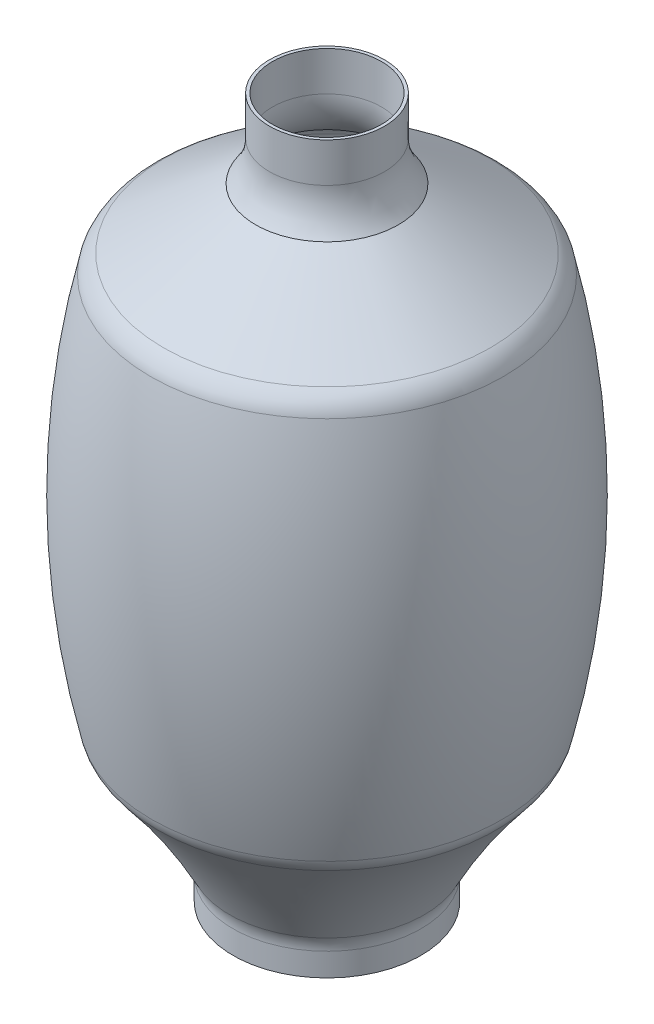
ISO-10303-21;
HEADER;
FILE_DESCRIPTION(('STEP AP214'),'2;1');
FILE_NAME('part.step','',(''),(''),'','','');
FILE_SCHEMA(('AUTOMOTIVE_DESIGN { 1 0 10303 214 1 1 1 1 }'));
ENDSEC;
DATA;
#1=APPLICATION_CONTEXT('core data for automotive mechanical design processes');
#2=APPLICATION_PROTOCOL_DEFINITION('international standard','automotive_design',2000,#1);
#3=PRODUCT_CONTEXT('',#1,'mechanical');
#4=PRODUCT('Part','Part','',(#3));
#5=PRODUCT_RELATED_PRODUCT_CATEGORY('part','',(#4));
#6=PRODUCT_DEFINITION_FORMATION('','',#4);
#7=PRODUCT_DEFINITION_CONTEXT('part definition',#1,'design');
#8=PRODUCT_DEFINITION('design','',#6,#7);
#9=PRODUCT_DEFINITION_SHAPE('','',#8);
#10=(LENGTH_UNIT() NAMED_UNIT(*) SI_UNIT(.MILLI.,.METRE.));
#11=(NAMED_UNIT(*) PLANE_ANGLE_UNIT() SI_UNIT($,.RADIAN.));
#12=(NAMED_UNIT(*) SI_UNIT($,.STERADIAN.) SOLID_ANGLE_UNIT());
#13=UNCERTAINTY_MEASURE_WITH_UNIT(LENGTH_MEASURE(1.E-05),#10,'distance_accuracy_value','');
#14=(GEOMETRIC_REPRESENTATION_CONTEXT(3) GLOBAL_UNCERTAINTY_ASSIGNED_CONTEXT((#13)) GLOBAL_UNIT_ASSIGNED_CONTEXT((#10,
#11,#12)) REPRESENTATION_CONTEXT('',''));
#15=CARTESIAN_POINT('',(0.,0.,0.));
#16=DIRECTION('',(0.,0.,1.));
#17=DIRECTION('',(1.,0.,0.));
#18=AXIS2_PLACEMENT_3D('',#15,#16,#17);
#19=CARTESIAN_POINT('',(57.3,-126.737836382813,0.));
#20=DIRECTION('',(0.,-1.,0.));
#21=DIRECTION('',(0.,0.,-1.));
#22=AXIS2_PLACEMENT_3D('',#19,#20,#21);
#23=TOROIDAL_SURFACE('',#22,206.488914650666,195.754467192042);
#24=CARTESIAN_POINT('',(57.3,-37.8267914431677,0.));
#25=DIRECTION('',(0.,-1.,0.));
#26=DIRECTION('',(0.,0.,-1.));
#27=AXIS2_PLACEMENT_3D('',#24,#25,#26);
#28=CIRCLE('',#27,32.0909860122193);
#29=CARTESIAN_POINT('',(57.3,-37.8267914431677,-32.0909860122193));
#30=VERTEX_POINT('',#29);
#31=EDGE_CURVE('E51',#30,#30,#28,.F.);
#32=ORIENTED_EDGE('',*,*,#31,.T.);
#33=EDGE_LOOP('',(#32));
#34=FACE_BOUND('',#33,.T.);
#35=CARTESIAN_POINT('',(57.3,-1.74966390814843,0.));
#36=DIRECTION('',(0.,-1.,0.));
#37=DIRECTION('',(0.,0.,-1.));
#38=AXIS2_PLACEMENT_3D('',#35,#36,#37);
#39=CIRCLE('',#38,55.8311296972031);
#40=CARTESIAN_POINT('',(57.3,-1.74966390814843,-55.8311296972031));
#41=VERTEX_POINT('',#40);
#42=EDGE_CURVE('E55',#41,#41,#39,.T.);
#43=ORIENTED_EDGE('',*,*,#42,.T.);
#44=EDGE_LOOP('',(#43));
#45=FACE_BOUND('',#44,.T.);
#46=ADVANCED_FACE('F44',(#34,#45),#23,.F.);
#47=CARTESIAN_POINT('',(57.3,66.5,0.));
#48=DIRECTION('',(0.,-1.,0.));
#49=DIRECTION('',(0.,0.,-1.));
#50=AXIS2_PLACEMENT_3D('',#47,#48,#49);
#51=DEGENERATE_TOROIDAL_SURFACE('',#50,211.599144662083,277.,.F.);
#52=CARTESIAN_POINT('',(57.3,2.31825157765581,0.));
#53=DIRECTION('',(0.,1.,0.));
#54=DIRECTION('',(0.,0.,1.));
#55=AXIS2_PLACEMENT_3D('',#52,#53,#54);
#56=CIRCLE('',#55,57.8627323622017);
#57=CARTESIAN_POINT('',(57.3,2.31825157765581,57.8627323622017));
#58=VERTEX_POINT('',#57);
#59=EDGE_CURVE('E12',#58,#58,#56,.T.);
#60=ORIENTED_EDGE('',*,*,#59,.T.);
#61=EDGE_LOOP('',(#60));
#62=FACE_BOUND('',#61,.T.);
#63=CARTESIAN_POINT('',(57.3,129.068053836591,0.));
#64=DIRECTION('',(0.,-1.,0.));
#65=DIRECTION('',(0.,0.,-1.));
#66=AXIS2_PLACEMENT_3D('',#63,#64,#65);
#67=CIRCLE('',#66,58.2419912662652);
#68=CARTESIAN_POINT('',(57.3,129.068053836591,-58.2419912662652));
#69=VERTEX_POINT('',#68);
#70=EDGE_CURVE('E67',#69,#69,#67,.T.);
#71=ORIENTED_EDGE('',*,*,#70,.T.);
#72=EDGE_LOOP('',(#71));
#73=FACE_BOUND('',#72,.T.);
#74=ADVANCED_FACE('F134',(#62,#73),#51,.F.);
#75=CARTESIAN_POINT('',(57.3,155.097315696071,0.));
#76=DIRECTION('',(0.,-1.,0.));
#77=DIRECTION('',(0.,0.,-1.));
#78=AXIS2_PLACEMENT_3D('',#75,#76,#77);
#79=CONICAL_SURFACE('',#78,23.5597149693681,0.99096751911094);
#80=CARTESIAN_POINT('',(57.3,135.174843881302,0.));
#81=DIRECTION('',(0.,1.,0.));
#82=DIRECTION('',(0.,0.,1.));
#83=AXIS2_PLACEMENT_3D('',#80,#81,#82);
#84=CIRCLE('',#83,53.9792413403725);
#85=CARTESIAN_POINT('',(57.3,135.174843881302,53.9792413403725));
#86=VERTEX_POINT('',#85);
#87=EDGE_CURVE('E64',#86,#86,#84,.T.);
#88=ORIENTED_EDGE('',*,*,#87,.T.);
#89=EDGE_LOOP('',(#88));
#90=FACE_BOUND('',#89,.T.);
#91=CARTESIAN_POINT('',(57.3,155.097315696071,0.));
#92=DIRECTION('',(0.,-1.,0.));
#93=DIRECTION('',(0.,0.,-1.));
#94=AXIS2_PLACEMENT_3D('',#91,#92,#93);
#95=CIRCLE('',#94,23.5597149693681);
#96=CARTESIAN_POINT('',(57.3,155.097315696071,-23.5597149693681));
#97=VERTEX_POINT('',#96);
#98=EDGE_CURVE('E70',#97,#97,#95,.T.);
#99=ORIENTED_EDGE('',*,*,#98,.T.);
#100=EDGE_LOOP('',(#99));
#101=FACE_BOUND('',#100,.T.);
#102=ADVANCED_FACE('F139',(#90,#101),#79,.T.);
#103=CARTESIAN_POINT('',(57.3,167.590689380213,0.));
#104=DIRECTION('',(0.,-1.,0.));
#105=DIRECTION('',(0.,0.,-1.));
#106=AXIS2_PLACEMENT_3D('',#103,#104,#105);
#107=TOROIDAL_SURFACE('',#106,38.377072099588,19.3813946437325);
#108=ORIENTED_EDGE('',*,*,#98,.F.);
#109=EDGE_LOOP('',(#108));
#110=FACE_BOUND('',#109,.T.);
#111=CARTESIAN_POINT('',(57.3,168.,0.));
#112=DIRECTION('',(0.,-1.,0.));
#113=DIRECTION('',(0.,0.,-1.));
#114=AXIS2_PLACEMENT_3D('',#111,#112,#113);
#115=CIRCLE('',#114,19.);
#116=CARTESIAN_POINT('',(57.3,168.,-19.));
#117=VERTEX_POINT('',#116);
#118=EDGE_CURVE('E73',#117,#117,#115,.T.);
#119=ORIENTED_EDGE('',*,*,#118,.T.);
#120=EDGE_LOOP('',(#119));
#121=FACE_BOUND('',#120,.T.);
#122=ADVANCED_FACE('F177',(#110,#121),#107,.F.);
#123=CARTESIAN_POINT('',(57.3,0.,0.));
#124=DIRECTION('',(0.,-1.,0.));
#125=DIRECTION('',(0.,0.,-1.));
#126=AXIS2_PLACEMENT_3D('',#123,#124,#125);
#127=CYLINDRICAL_SURFACE('',#126,19.);
#128=ORIENTED_EDGE('',*,*,#118,.F.);
#129=EDGE_LOOP('',(#128));
#130=FACE_BOUND('',#129,.T.);
#131=CARTESIAN_POINT('',(57.3,181.,0.));
#132=DIRECTION('',(0.,-1.,0.));
#133=DIRECTION('',(0.,0.,-1.));
#134=AXIS2_PLACEMENT_3D('',#131,#132,#133);
#135=CIRCLE('',#134,19.);
#136=CARTESIAN_POINT('',(57.3,181.,-19.));
#137=VERTEX_POINT('',#136);
#138=EDGE_CURVE('E76',#137,#137,#135,.T.);
#139=ORIENTED_EDGE('',*,*,#138,.T.);
#140=EDGE_LOOP('',(#139));
#141=FACE_BOUND('',#140,.T.);
#142=ADVANCED_FACE('F170',(#130,#141),#127,.T.);
#143=CARTESIAN_POINT('',(57.3,181.,0.));
#144=DIRECTION('',(0.,-1.,0.));
#145=DIRECTION('',(0.,0.,-1.));
#146=AXIS2_PLACEMENT_3D('',#143,#144,#145);
#147=PLANE('',#146);
#148=CARTESIAN_POINT('',(57.3,181.,0.));
#149=DIRECTION('',(0.,-1.,0.));
#150=DIRECTION('',(0.,0.,-1.));
#151=AXIS2_PLACEMENT_3D('',#148,#149,#150);
#152=CIRCLE('',#151,18.);
#153=CARTESIAN_POINT('',(57.3,181.,-18.));
#154=VERTEX_POINT('',#153);
#155=EDGE_CURVE('E83',#154,#154,#152,.T.);
#156=ORIENTED_EDGE('',*,*,#155,.T.);
#157=EDGE_LOOP('',(#156));
#158=FACE_BOUND('',#157,.T.);
#159=ORIENTED_EDGE('',*,*,#138,.F.);
#160=EDGE_LOOP('',(#159));
#161=FACE_BOUND('',#160,.T.);
#162=ADVANCED_FACE('F164',(#158,#161),#147,.F.);
#163=CARTESIAN_POINT('',(57.3,-50.,0.));
#164=DIRECTION('',(0.,1.,0.));
#165=DIRECTION('',(0.,0.,1.));
#166=AXIS2_PLACEMENT_3D('',#163,#164,#165);
#167=PLANE('',#166);
#168=CARTESIAN_POINT('',(57.3,-50.,0.));
#169=DIRECTION('',(0.,1.,0.));
#170=DIRECTION('',(0.,0.,1.));
#171=AXIS2_PLACEMENT_3D('',#168,#169,#170);
#172=CIRCLE('',#171,30.);
#173=CARTESIAN_POINT('',(57.3,-50.,30.));
#174=VERTEX_POINT('',#173);
#175=EDGE_CURVE('E87',#174,#174,#172,.F.);
#176=ORIENTED_EDGE('',*,*,#175,.F.);
#177=EDGE_LOOP('',(#176));
#178=FACE_BOUND('',#177,.T.);
#179=CARTESIAN_POINT('',(57.3,-50.,0.));
#180=DIRECTION('',(0.,-1.,0.));
#181=DIRECTION('',(0.,0.,-1.));
#182=AXIS2_PLACEMENT_3D('',#179,#180,#181);
#183=CIRCLE('',#182,31.);
#184=CARTESIAN_POINT('',(57.3,-50.,-31.));
#185=VERTEX_POINT('',#184);
#186=EDGE_CURVE('E79',#185,#185,#183,.T.);
#187=ORIENTED_EDGE('',*,*,#186,.T.);
#188=EDGE_LOOP('',(#187));
#189=FACE_BOUND('',#188,.T.);
#190=ADVANCED_FACE('F160',(#178,#189),#167,.F.);
#191=CARTESIAN_POINT('',(57.3,0.,0.));
#192=DIRECTION('',(0.,-1.,0.));
#193=DIRECTION('',(0.,0.,-1.));
#194=AXIS2_PLACEMENT_3D('',#191,#192,#193);
#195=CYLINDRICAL_SURFACE('',#194,31.);
#196=CARTESIAN_POINT('',(57.3,-42.3687590526435,0.));
#197=DIRECTION('',(0.,-1.,0.));
#198=DIRECTION('',(0.,0.,-1.));
#199=AXIS2_PLACEMENT_3D('',#196,#197,#198);
#200=CIRCLE('',#199,31.);
#201=CARTESIAN_POINT('',(57.3,-42.3687590526435,-31.));
#202=VERTEX_POINT('',#201);
#203=EDGE_CURVE('E59',#202,#202,#200,.T.);
#204=ORIENTED_EDGE('',*,*,#203,.T.);
#205=EDGE_LOOP('',(#204));
#206=FACE_BOUND('',#205,.T.);
#207=ORIENTED_EDGE('',*,*,#186,.F.);
#208=EDGE_LOOP('',(#207));
#209=FACE_BOUND('',#208,.T.);
#210=ADVANCED_FACE('F147',(#206,#209),#195,.T.);
#211=CARTESIAN_POINT('',(57.3,126.809279329855,0.));
#212=DIRECTION('',(0.,1.,0.));
#213=DIRECTION('',(0.,0.,1.));
#214=AXIS2_PLACEMENT_3D('',#211,#212,#213);
#215=TOROIDAL_SURFACE('',#214,48.5004340125342,10.);
#216=ORIENTED_EDGE('',*,*,#87,.F.);
#217=EDGE_LOOP('',(#216));
#218=FACE_BOUND('',#217,.T.);
#219=ORIENTED_EDGE('',*,*,#70,.F.);
#220=EDGE_LOOP('',(#219));
#221=FACE_BOUND('',#220,.T.);
#222=ADVANCED_FACE('F144',(#218,#221),#215,.T.);
#223=CARTESIAN_POINT('',(57.3,-42.3687590526435,0.));
#224=DIRECTION('',(0.,-1.,0.));
#225=DIRECTION('',(0.,0.,-1.));
#226=AXIS2_PLACEMENT_3D('',#223,#224,#225);
#227=TOROIDAL_SURFACE('',#226,41.,10.);
#228=ORIENTED_EDGE('',*,*,#31,.F.);
#229=EDGE_LOOP('',(#228));
#230=FACE_BOUND('',#229,.T.);
#231=ORIENTED_EDGE('',*,*,#203,.F.);
#232=EDGE_LOOP('',(#231));
#233=FACE_BOUND('',#232,.T.);
#234=ADVANCED_FACE('F146',(#230,#233),#227,.F.);
#235=CARTESIAN_POINT('',(57.3,4.63528220662131,0.));
#236=DIRECTION('',(0.,1.,0.));
#237=DIRECTION('',(0.,0.,1.));
#238=AXIS2_PLACEMENT_3D('',#235,#236,#237);
#239=TOROIDAL_SURFACE('',#238,48.1348667656572,10.);
#240=ORIENTED_EDGE('',*,*,#59,.F.);
#241=EDGE_LOOP('',(#240));
#242=FACE_BOUND('',#241,.T.);
#243=ORIENTED_EDGE('',*,*,#42,.F.);
#244=EDGE_LOOP('',(#243));
#245=FACE_BOUND('',#244,.T.);
#246=ADVANCED_FACE('F46',(#242,#245),#239,.T.);
#247=CARTESIAN_POINT('',(57.3,-126.737836382813,0.));
#248=DIRECTION('',(0.,-1.,0.));
#249=DIRECTION('',(0.,0.,-1.));
#250=AXIS2_PLACEMENT_3D('',#247,#248,#249);
#251=TOROIDAL_SURFACE('',#250,206.488914650666,196.754467192042);
#252=CARTESIAN_POINT('',(57.3,-37.3725946822202,0.));
#253=DIRECTION('',(0.,-1.,0.));
#254=DIRECTION('',(0.,0.,-1.));
#255=AXIS2_PLACEMENT_3D('',#252,#253,#254);
#256=CIRCLE('',#255,31.2000846134412);
#257=CARTESIAN_POINT('',(57.3,-37.3725946822202,-31.2000846134412));
#258=VERTEX_POINT('',#257);
#259=EDGE_CURVE('E104',#258,#258,#256,.F.);
#260=ORIENTED_EDGE('',*,*,#259,.F.);
#261=EDGE_LOOP('',(#260));
#262=FACE_BOUND('',#261,.T.);
#263=CARTESIAN_POINT('',(57.3,-1.11116929667143,0.));
#264=DIRECTION('',(0.,-1.,0.));
#265=DIRECTION('',(0.,0.,-1.));
#266=AXIS2_PLACEMENT_3D('',#263,#264,#265);
#267=CIRCLE('',#266,55.0615034040484);
#268=CARTESIAN_POINT('',(57.3,-1.11116929667143,-55.0615034040484));
#269=VERTEX_POINT('',#268);
#270=EDGE_CURVE('E107',#269,#269,#267,.T.);
#271=ORIENTED_EDGE('',*,*,#270,.F.);
#272=EDGE_LOOP('',(#271));
#273=FACE_BOUND('',#272,.T.);
#274=ADVANCED_FACE('F116',(#262,#273),#251,.T.);
#275=CARTESIAN_POINT('',(57.3,66.5,0.));
#276=DIRECTION('',(0.,-1.,0.));
#277=DIRECTION('',(0.,0.,-1.));
#278=AXIS2_PLACEMENT_3D('',#275,#276,#277);
#279=DEGENERATE_TOROIDAL_SURFACE('',#278,211.599144662083,276.,.F.);
#280=CARTESIAN_POINT('',(57.3,2.54995464055237,0.));
#281=DIRECTION('',(0.,-1.,0.));
#282=DIRECTION('',(0.,0.,-1.));
#283=AXIS2_PLACEMENT_3D('',#280,#281,#282);
#284=CIRCLE('',#283,56.8899458025473);
#285=CARTESIAN_POINT('',(57.3,2.54995464055237,-56.8899458025473));
#286=VERTEX_POINT('',#285);
#287=EDGE_CURVE('E82',#286,#286,#284,.F.);
#288=ORIENTED_EDGE('',*,*,#287,.F.);
#289=EDGE_LOOP('',(#288));
#290=FACE_BOUND('',#289,.T.);
#291=CARTESIAN_POINT('',(57.3,128.842176385917,0.));
#292=DIRECTION('',(0.,-1.,0.));
#293=DIRECTION('',(0.,0.,-1.));
#294=AXIS2_PLACEMENT_3D('',#291,#292,#293);
#295=CIRCLE('',#294,57.2678355408921);
#296=CARTESIAN_POINT('',(57.3,128.842176385917,-57.2678355408921));
#297=VERTEX_POINT('',#296);
#298=EDGE_CURVE('E95',#297,#297,#295,.T.);
#299=ORIENTED_EDGE('',*,*,#298,.F.);
#300=EDGE_LOOP('',(#299));
#301=FACE_BOUND('',#300,.T.);
#302=ADVANCED_FACE('F119',(#290,#301),#279,.T.);
#303=CARTESIAN_POINT('',(57.3,154.260759240926,0.));
#304=DIRECTION('',(0.,-1.,0.));
#305=DIRECTION('',(0.,0.,-1.));
#306=AXIS2_PLACEMENT_3D('',#303,#304,#305);
#307=CONICAL_SURFACE('',#306,23.0118342365843,0.99096751911094);
#308=CARTESIAN_POINT('',(57.3,134.338287426157,0.));
#309=DIRECTION('',(0.,-1.,0.));
#310=DIRECTION('',(0.,0.,-1.));
#311=AXIS2_PLACEMENT_3D('',#308,#309,#310);
#312=CIRCLE('',#311,53.4313606075887);
#313=CARTESIAN_POINT('',(57.3,134.338287426157,-53.4313606075887));
#314=VERTEX_POINT('',#313);
#315=EDGE_CURVE('E96',#314,#314,#312,.F.);
#316=ORIENTED_EDGE('',*,*,#315,.F.);
#317=EDGE_LOOP('',(#316));
#318=FACE_BOUND('',#317,.T.);
#319=CARTESIAN_POINT('',(57.3,154.339863051722,0.));
#320=DIRECTION('',(0.,-1.,0.));
#321=DIRECTION('',(0.,0.,-1.));
#322=AXIS2_PLACEMENT_3D('',#319,#320,#321);
#323=CIRCLE('',#322,22.8910510084315);
#324=CARTESIAN_POINT('',(57.3,154.339863051722,-22.8910510084315));
#325=VERTEX_POINT('',#324);
#326=EDGE_CURVE('E92',#325,#325,#323,.T.);
#327=ORIENTED_EDGE('',*,*,#326,.F.);
#328=EDGE_LOOP('',(#327));
#329=FACE_BOUND('',#328,.T.);
#330=ADVANCED_FACE('F234',(#318,#329),#307,.F.);
#331=CARTESIAN_POINT('',(57.3,167.590689380213,0.));
#332=DIRECTION('',(0.,-1.,0.));
#333=DIRECTION('',(0.,0.,-1.));
#334=AXIS2_PLACEMENT_3D('',#331,#332,#333);
#335=TOROIDAL_SURFACE('',#334,38.377072099588,20.3813946437325);
#336=ORIENTED_EDGE('',*,*,#326,.T.);
#337=EDGE_LOOP('',(#336));
#338=FACE_BOUND('',#337,.T.);
#339=CARTESIAN_POINT('',(57.3,168.010427717465,0.));
#340=DIRECTION('',(0.,-1.,0.));
#341=DIRECTION('',(0.,0.,-1.));
#342=AXIS2_PLACEMENT_3D('',#339,#340,#341);
#343=CIRCLE('',#342,18.);
#344=CARTESIAN_POINT('',(57.3,168.010427717465,-18.));
#345=VERTEX_POINT('',#344);
#346=EDGE_CURVE('E86',#345,#345,#343,.T.);
#347=ORIENTED_EDGE('',*,*,#346,.F.);
#348=EDGE_LOOP('',(#347));
#349=FACE_BOUND('',#348,.T.);
#350=ADVANCED_FACE('F244',(#338,#349),#335,.T.);
#351=CARTESIAN_POINT('',(57.3,0.,0.));
#352=DIRECTION('',(0.,-1.,0.));
#353=DIRECTION('',(0.,0.,-1.));
#354=AXIS2_PLACEMENT_3D('',#351,#352,#353);
#355=CYLINDRICAL_SURFACE('',#354,18.);
#356=ORIENTED_EDGE('',*,*,#346,.T.);
#357=EDGE_LOOP('',(#356));
#358=FACE_BOUND('',#357,.T.);
#359=ORIENTED_EDGE('',*,*,#155,.F.);
#360=EDGE_LOOP('',(#359));
#361=FACE_BOUND('',#360,.T.);
#362=ADVANCED_FACE('F254',(#358,#361),#355,.F.);
#363=CARTESIAN_POINT('',(57.3,0.,0.));
#364=DIRECTION('',(0.,-1.,0.));
#365=DIRECTION('',(0.,0.,-1.));
#366=AXIS2_PLACEMENT_3D('',#363,#364,#365);
#367=CYLINDRICAL_SURFACE('',#366,30.);
#368=CARTESIAN_POINT('',(57.3,-42.3687590526435,0.));
#369=DIRECTION('',(0.,-1.,0.));
#370=DIRECTION('',(0.,0.,-1.));
#371=AXIS2_PLACEMENT_3D('',#368,#369,#370);
#372=CIRCLE('',#371,30.);
#373=CARTESIAN_POINT('',(57.3,-42.3687590526435,-30.));
#374=VERTEX_POINT('',#373);
#375=EDGE_CURVE('E99',#374,#374,#372,.T.);
#376=ORIENTED_EDGE('',*,*,#375,.F.);
#377=EDGE_LOOP('',(#376));
#378=FACE_BOUND('',#377,.T.);
#379=ORIENTED_EDGE('',*,*,#175,.T.);
#380=EDGE_LOOP('',(#379));
#381=FACE_BOUND('',#380,.T.);
#382=ADVANCED_FACE('F264',(#378,#381),#367,.F.);
#383=CARTESIAN_POINT('',(57.3,126.809279329855,0.));
#384=DIRECTION('',(0.,1.,0.));
#385=DIRECTION('',(0.,0.,1.));
#386=AXIS2_PLACEMENT_3D('',#383,#384,#385);
#387=TOROIDAL_SURFACE('',#386,48.5004340125342,9.);
#388=ORIENTED_EDGE('',*,*,#315,.T.);
#389=EDGE_LOOP('',(#388));
#390=FACE_BOUND('',#389,.T.);
#391=ORIENTED_EDGE('',*,*,#298,.T.);
#392=EDGE_LOOP('',(#391));
#393=FACE_BOUND('',#392,.T.);
#394=ADVANCED_FACE('F130',(#390,#393),#387,.F.);
#395=CARTESIAN_POINT('',(57.3,-42.3687590526435,0.));
#396=DIRECTION('',(0.,-1.,0.));
#397=DIRECTION('',(0.,0.,-1.));
#398=AXIS2_PLACEMENT_3D('',#395,#396,#397);
#399=TOROIDAL_SURFACE('',#398,41.,11.);
#400=ORIENTED_EDGE('',*,*,#259,.T.);
#401=EDGE_LOOP('',(#400));
#402=FACE_BOUND('',#401,.T.);
#403=ORIENTED_EDGE('',*,*,#375,.T.);
#404=EDGE_LOOP('',(#403));
#405=FACE_BOUND('',#404,.T.);
#406=ADVANCED_FACE('F113',(#402,#405),#399,.T.);
#407=CARTESIAN_POINT('',(57.3,4.63528220662131,0.));
#408=DIRECTION('',(0.,1.,0.));
#409=DIRECTION('',(0.,0.,1.));
#410=AXIS2_PLACEMENT_3D('',#407,#408,#409);
#411=TOROIDAL_SURFACE('',#410,48.1348667656572,9.);
#412=ORIENTED_EDGE('',*,*,#287,.T.);
#413=EDGE_LOOP('',(#412));
#414=FACE_BOUND('',#413,.T.);
#415=ORIENTED_EDGE('',*,*,#270,.T.);
#416=EDGE_LOOP('',(#415));
#417=FACE_BOUND('',#416,.T.);
#418=ADVANCED_FACE('F123',(#414,#417),#411,.F.);
#419=CLOSED_SHELL('',(#46,#74,#102,#122,#142,#162,#190,#210,#222,#234,#246,#274,#302,#330,#350,
#362,#382,#394,#406,#418));
#420=MANIFOLD_SOLID_BREP('B2',#419);
#421=ADVANCED_BREP_SHAPE_REPRESENTATION('',(#18,#420),#14);
#422=SHAPE_DEFINITION_REPRESENTATION(#9,#421);
ENDSEC;
END-ISO-10303-21;
